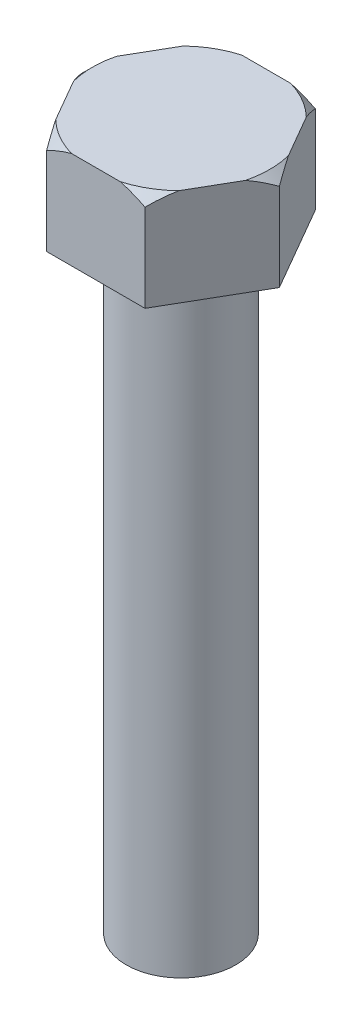
ISO-10303-21;
HEADER;
FILE_DESCRIPTION(('STEP AP214'),'2;1');
FILE_NAME('part.step','',(''),(''),'','','');
FILE_SCHEMA(('AUTOMOTIVE_DESIGN { 1 0 10303 214 1 1 1 1 }'));
ENDSEC;
DATA;
#1=APPLICATION_CONTEXT('core data for automotive mechanical design processes');
#2=APPLICATION_PROTOCOL_DEFINITION('international standard','automotive_design',2000,#1);
#3=PRODUCT_CONTEXT('',#1,'mechanical');
#4=PRODUCT('Part','Part','',(#3));
#5=PRODUCT_RELATED_PRODUCT_CATEGORY('part','',(#4));
#6=PRODUCT_DEFINITION_FORMATION('','',#4);
#7=PRODUCT_DEFINITION_CONTEXT('part definition',#1,'design');
#8=PRODUCT_DEFINITION('design','',#6,#7);
#9=PRODUCT_DEFINITION_SHAPE('','',#8);
#10=(LENGTH_UNIT() NAMED_UNIT(*) SI_UNIT(.MILLI.,.METRE.));
#11=(NAMED_UNIT(*) PLANE_ANGLE_UNIT() SI_UNIT($,.RADIAN.));
#12=(NAMED_UNIT(*) SI_UNIT($,.STERADIAN.) SOLID_ANGLE_UNIT());
#13=UNCERTAINTY_MEASURE_WITH_UNIT(LENGTH_MEASURE(1.E-05),#10,'distance_accuracy_value','');
#14=(GEOMETRIC_REPRESENTATION_CONTEXT(3) GLOBAL_UNCERTAINTY_ASSIGNED_CONTEXT((#13)) GLOBAL_UNIT_ASSIGNED_CONTEXT((#10,
#11,#12)) REPRESENTATION_CONTEXT('',''));
#15=CARTESIAN_POINT('',(0.,0.,0.));
#16=DIRECTION('',(0.,0.,1.));
#17=DIRECTION('',(1.,0.,0.));
#18=AXIS2_PLACEMENT_3D('',#15,#16,#17);
#19=CARTESIAN_POINT('',(0.,29.,0.));
#20=DIRECTION('',(0.,1.,0.));
#21=DIRECTION('',(0.,0.,1.));
#22=AXIS2_PLACEMENT_3D('',#19,#20,#21);
#23=PLANE('',#22);
#24=CARTESIAN_POINT('',(0.,29.,0.));
#25=DIRECTION('',(0.,1.,0.));
#26=DIRECTION('',(0.,0.,1.));
#27=AXIS2_PLACEMENT_3D('',#24,#25,#26);
#28=CIRCLE('',#27,3.64145188432738);
#29=CARTESIAN_POINT('',(-1.00507304504271,29.,3.5));
#30=VERTEX_POINT('',#29);
#31=CARTESIAN_POINT('',(-2.52855239072418,29.,2.62041878966597));
#32=VERTEX_POINT('',#31);
#33=EDGE_CURVE('E11',#30,#32,#28,.F.);
#34=ORIENTED_EDGE('',*,*,#33,.F.);
#35=DIRECTION('',(1.,0.,0.));
#36=VECTOR('',#35,1.);
#37=CARTESIAN_POINT('',(0.,29.,3.5));
#38=LINE('',#37,#36);
#39=CARTESIAN_POINT('',(1.00507304504271,29.,3.5));
#40=VERTEX_POINT('',#39);
#41=EDGE_CURVE('E142',#30,#40,#38,.T.);
#42=ORIENTED_EDGE('',*,*,#41,.T.);
#43=CARTESIAN_POINT('',(2.52855239072418,29.,2.62041878966597));
#44=VERTEX_POINT('',#43);
#45=EDGE_CURVE('E43',#44,#40,#28,.F.);
#46=ORIENTED_EDGE('',*,*,#45,.F.);
#47=DIRECTION('',(0.5,0.,-0.866025403784439));
#48=VECTOR('',#47,1.);
#49=CARTESIAN_POINT('',(3.03108891324554,29.,1.75));
#50=LINE('',#49,#48);
#51=CARTESIAN_POINT('',(3.53362543576689,29.,0.879581210334031));
#52=VERTEX_POINT('',#51);
#53=EDGE_CURVE('E169',#44,#52,#50,.T.);
#54=ORIENTED_EDGE('',*,*,#53,.T.);
#55=CARTESIAN_POINT('',(3.53362543576689,29.,-0.879581210334034));
#56=VERTEX_POINT('',#55);
#57=EDGE_CURVE('E300',#56,#52,#28,.F.);
#58=ORIENTED_EDGE('',*,*,#57,.F.);
#59=DIRECTION('',(-0.5,0.,-0.866025403784439));
#60=VECTOR('',#59,1.);
#61=CARTESIAN_POINT('',(3.03108891324554,29.,-1.75));
#62=LINE('',#61,#60);
#63=CARTESIAN_POINT('',(2.52855239072418,29.,-2.62041878966597));
#64=VERTEX_POINT('',#63);
#65=EDGE_CURVE('E266',#56,#64,#62,.T.);
#66=ORIENTED_EDGE('',*,*,#65,.T.);
#67=CARTESIAN_POINT('',(1.00507304504271,29.,-3.5));
#68=VERTEX_POINT('',#67);
#69=EDGE_CURVE('E274',#68,#64,#28,.F.);
#70=ORIENTED_EDGE('',*,*,#69,.F.);
#71=DIRECTION('',(-1.,0.,0.));
#72=VECTOR('',#71,1.);
#73=CARTESIAN_POINT('',(0.,29.,-3.5));
#74=LINE('',#73,#72);
#75=CARTESIAN_POINT('',(-1.00507304504271,29.,-3.5));
#76=VERTEX_POINT('',#75);
#77=EDGE_CURVE('E147',#68,#76,#74,.T.);
#78=ORIENTED_EDGE('',*,*,#77,.T.);
#79=CARTESIAN_POINT('',(-2.52855239072418,29.,-2.62041878966597));
#80=VERTEX_POINT('',#79);
#81=EDGE_CURVE('E272',#80,#76,#28,.F.);
#82=ORIENTED_EDGE('',*,*,#81,.F.);
#83=DIRECTION('',(-0.5,0.,0.866025403784439));
#84=VECTOR('',#83,1.);
#85=CARTESIAN_POINT('',(-3.03108891324553,29.,-1.75));
#86=LINE('',#85,#84);
#87=CARTESIAN_POINT('',(-3.53362543576689,29.,-0.879581210334033));
#88=VERTEX_POINT('',#87);
#89=EDGE_CURVE('E143',#80,#88,#86,.T.);
#90=ORIENTED_EDGE('',*,*,#89,.T.);
#91=CARTESIAN_POINT('',(-3.53362543576689,29.,0.879581210334033));
#92=VERTEX_POINT('',#91);
#93=EDGE_CURVE('E48',#92,#88,#28,.F.);
#94=ORIENTED_EDGE('',*,*,#93,.F.);
#95=DIRECTION('',(0.5,0.,0.866025403784439));
#96=VECTOR('',#95,1.);
#97=CARTESIAN_POINT('',(-3.03108891324553,29.,1.75));
#98=LINE('',#97,#96);
#99=EDGE_CURVE('E136',#92,#32,#98,.T.);
#100=ORIENTED_EDGE('',*,*,#99,.T.);
#101=EDGE_LOOP('',(#34,#42,#46,#54,#58,#66,#70,#78,#82,#90,#94,#100));
#102=FACE_BOUND('',#101,.T.);
#103=ADVANCED_FACE('F39',(#102),#23,.T.);
#104=CARTESIAN_POINT('',(0.,25.,0.));
#105=DIRECTION('',(0.,-1.,0.));
#106=DIRECTION('',(0.,0.,-1.));
#107=AXIS2_PLACEMENT_3D('',#104,#105,#106);
#108=CYLINDRICAL_SURFACE('',#107,2.25);
#109=CARTESIAN_POINT('',(0.,25.,0.));
#110=DIRECTION('',(0.,1.,0.));
#111=DIRECTION('',(0.,0.,1.));
#112=AXIS2_PLACEMENT_3D('',#109,#110,#111);
#113=CIRCLE('',#112,2.25);
#114=CARTESIAN_POINT('',(0.,25.,2.25));
#115=VERTEX_POINT('',#114);
#116=EDGE_CURVE('E181',#115,#115,#113,.T.);
#117=ORIENTED_EDGE('',*,*,#116,.F.);
#118=EDGE_LOOP('',(#117));
#119=FACE_BOUND('',#118,.T.);
#120=CARTESIAN_POINT('',(0.,0.,0.));
#121=DIRECTION('',(0.,1.,0.));
#122=DIRECTION('',(0.,0.,1.));
#123=AXIS2_PLACEMENT_3D('',#120,#121,#122);
#124=CIRCLE('',#123,2.25);
#125=CARTESIAN_POINT('',(0.,0.,2.25));
#126=VERTEX_POINT('',#125);
#127=EDGE_CURVE('E180',#126,#126,#124,.T.);
#128=ORIENTED_EDGE('',*,*,#127,.T.);
#129=EDGE_LOOP('',(#128));
#130=FACE_BOUND('',#129,.T.);
#131=ADVANCED_FACE('F41',(#119,#130),#108,.T.);
#132=CARTESIAN_POINT('',(0.,0.,0.));
#133=DIRECTION('',(0.,1.,0.));
#134=DIRECTION('',(0.,0.,1.));
#135=AXIS2_PLACEMENT_3D('',#132,#133,#134);
#136=PLANE('',#135);
#137=ORIENTED_EDGE('',*,*,#127,.F.);
#138=EDGE_LOOP('',(#137));
#139=FACE_BOUND('',#138,.T.);
#140=ADVANCED_FACE('F187',(#139),#136,.F.);
#141=CARTESIAN_POINT('',(3.03108891324554,29.,1.75));
#142=DIRECTION('',(-0.866025403784439,0.,-0.5));
#143=DIRECTION('',(-0.5,0.,0.866025403784439));
#144=AXIS2_PLACEMENT_3D('',#141,#142,#143);
#145=PLANE('',#144);
#146=DIRECTION('',(0.,-1.,0.));
#147=VECTOR('',#146,1.);
#148=CARTESIAN_POINT('',(4.04145188432738,29.,0.));
#149=LINE('',#148,#147);
#150=CARTESIAN_POINT('',(4.04145188432738,28.6,0.));
#151=VERTEX_POINT('',#150);
#152=CARTESIAN_POINT('',(4.04145188432738,25.,0.));
#153=VERTEX_POINT('',#152);
#154=EDGE_CURVE('E178',#151,#153,#149,.T.);
#155=ORIENTED_EDGE('',*,*,#154,.F.);
#156=CARTESIAN_POINT('',(4.04185602951581,28.5995957941958,-0.000700000000000803));
#157=CARTESIAN_POINT('',(4.00710000804431,28.6343560383964,0.0594991950575953));
#158=CARTESIAN_POINT('',(3.97207797795043,28.6680501603169,0.120159130564405));
#159=CARTESIAN_POINT('',(3.90144705858413,28.7329810613726,0.242495471492139));
#160=CARTESIAN_POINT('',(3.86583786127703,28.7642164976156,0.304172410444787));
#161=CARTESIAN_POINT('',(3.75771605567358,28.8540137903599,0.491444871156037));
#162=CARTESIAN_POINT('',(3.68428424700295,28.9082831640575,0.618632494665241));
#163=CARTESIAN_POINT('',(3.53623163816097,29.0012236799121,0.875067135372671));
#164=CARTESIAN_POINT('',(3.46164827767626,29.0401289976709,1.00424930513143));
#165=CARTESIAN_POINT('',(3.31083374854042,29.1000772712033,1.26546773211428));
#166=CARTESIAN_POINT('',(3.23460720553374,29.1211649889939,1.39749597748718));
#167=CARTESIAN_POINT('',(3.10324884559524,29.1401900959649,1.62501533089957));
#168=CARTESIAN_POINT('',(3.04828650790208,29.1430074756386,1.7202128922869));
#169=CARTESIAN_POINT('',(2.93845087445834,29.1382704066968,1.91045378989296));
#170=CARTESIAN_POINT('',(2.88357761668902,29.1307123207898,2.00549706032624));
#171=CARTESIAN_POINT('',(2.77435085644443,29.105655411488,2.19468335861602));
#172=CARTESIAN_POINT('',(2.71999800529152,29.0881454583365,2.28882525834909));
#173=CARTESIAN_POINT('',(2.61222572095588,29.0441407177875,2.47549233046617));
#174=CARTESIAN_POINT('',(2.55880621658997,29.0176466187531,2.56801762614308));
#175=CARTESIAN_POINT('',(2.46394385258427,28.9631195495437,2.73232406032705));
#176=CARTESIAN_POINT('',(2.42229155147872,28.9365164818021,2.80446796209402));
#177=CARTESIAN_POINT('',(2.33973521538547,28.8790202066085,2.94745973069426));
#178=CARTESIAN_POINT('',(2.29883120381619,28.8481268651474,3.01830755696563));
#179=CARTESIAN_POINT('',(2.21790026519835,28.7827433327658,3.15848405455598));
#180=CARTESIAN_POINT('',(2.17787103570062,28.7482644470191,3.22781671383387));
#181=CARTESIAN_POINT('',(2.09855442737231,28.6761632616106,3.36519710934255));
#182=CARTESIAN_POINT('',(2.05926660994313,28.6385428966948,3.43324560524837));
#183=CARTESIAN_POINT('',(2.02032179697526,28.5995957941959,3.5007));
#184=B_SPLINE_CURVE_WITH_KNOTS('',3,(#156,#157,#158,#159,#160,#161,#162,#163,#164,#165,#166,
#167,#168,#169,#170,#171,#172,#173,#174,#175,#176,#177,#178,#179,#180,#181,#182,#183),
.UNSPECIFIED.,.F.,.F.,(4,2,2,2,2,2,2,2,2,2,2,2,2,4),(0.,0.233138513867682,0.466403492968363,
0.93545442848912,1.39705139101095,1.85748523555109,2.18690223171021,2.51643473995426,
2.84633651094476,3.17621301064566,3.43843771846077,3.70067061885163,3.96210042566853,
4.22337039640857),.UNSPECIFIED.);
#185=EDGE_CURVE('E155',#151,#52,#184,.T.);
#186=ORIENTED_EDGE('',*,*,#185,.T.);
#187=ORIENTED_EDGE('',*,*,#53,.F.);
#188=CARTESIAN_POINT('',(2.02072594216369,28.6,3.5));
#189=VERTEX_POINT('',#188);
#190=EDGE_CURVE('E228',#44,#189,#184,.T.);
#191=ORIENTED_EDGE('',*,*,#190,.T.);
#192=DIRECTION('',(0.,-1.,0.));
#193=VECTOR('',#192,1.);
#194=CARTESIAN_POINT('',(2.02072594216369,29.,3.5));
#195=LINE('',#194,#193);
#196=CARTESIAN_POINT('',(2.02072594216369,25.,3.5));
#197=VERTEX_POINT('',#196);
#198=EDGE_CURVE('E145',#189,#197,#195,.T.);
#199=ORIENTED_EDGE('',*,*,#198,.T.);
#200=DIRECTION('',(0.5,0.,-0.866025403784439));
#201=VECTOR('',#200,1.);
#202=CARTESIAN_POINT('',(3.03108891324554,25.,1.75));
#203=LINE('',#202,#201);
#204=EDGE_CURVE('E151',#197,#153,#203,.T.);
#205=ORIENTED_EDGE('',*,*,#204,.T.);
#206=EDGE_LOOP('',(#155,#186,#187,#191,#199,#205));
#207=FACE_BOUND('',#206,.T.);
#208=ADVANCED_FACE('F189',(#207),#145,.F.);
#209=CARTESIAN_POINT('',(3.03108891324554,29.,-1.75));
#210=DIRECTION('',(-0.866025403784438,0.,0.5));
#211=DIRECTION('',(0.5,0.,0.866025403784439));
#212=AXIS2_PLACEMENT_3D('',#209,#210,#211);
#213=PLANE('',#212);
#214=DIRECTION('',(0.,-1.,0.));
#215=VECTOR('',#214,1.);
#216=CARTESIAN_POINT('',(2.02072594216369,29.,-3.5));
#217=LINE('',#216,#215);
#218=CARTESIAN_POINT('',(2.02072594216369,28.6,-3.5));
#219=VERTEX_POINT('',#218);
#220=CARTESIAN_POINT('',(2.02072594216369,25.,-3.5));
#221=VERTEX_POINT('',#220);
#222=EDGE_CURVE('E176',#219,#221,#217,.T.);
#223=ORIENTED_EDGE('',*,*,#222,.F.);
#224=CARTESIAN_POINT('',(2.02032179697526,28.5995957941959,-3.5007));
#225=CARTESIAN_POINT('',(2.05507781844676,28.6343560383964,-3.4405008049424));
#226=CARTESIAN_POINT('',(2.09009984854064,28.6680501603169,-3.37984086943559));
#227=CARTESIAN_POINT('',(2.16073076790694,28.7329810613726,-3.25750452850786));
#228=CARTESIAN_POINT('',(2.19633996521405,28.7642164976156,-3.19582758955521));
#229=CARTESIAN_POINT('',(2.30446177081749,28.8540137903599,-3.00855512884396));
#230=CARTESIAN_POINT('',(2.37789357948812,28.9082831640575,-2.88136750533476));
#231=CARTESIAN_POINT('',(2.5259461883301,29.0012236799121,-2.62493286462733));
#232=CARTESIAN_POINT('',(2.60052954881481,29.0401289976709,-2.49575069486857));
#233=CARTESIAN_POINT('',(2.75134407795065,29.1000772712033,-2.23453226788572));
#234=CARTESIAN_POINT('',(2.82757062095733,29.1211649889939,-2.10250402251282));
#235=CARTESIAN_POINT('',(2.95892898089583,29.1401900959649,-1.87498466910043));
#236=CARTESIAN_POINT('',(3.01389131858899,29.1430074756386,-1.77978710771311));
#237=CARTESIAN_POINT('',(3.12372695203273,29.1382704066968,-1.58954621010704));
#238=CARTESIAN_POINT('',(3.17860020980205,29.1307123207898,-1.49450293967376));
#239=CARTESIAN_POINT('',(3.28782697004664,29.105655411488,-1.30531664138398));
#240=CARTESIAN_POINT('',(3.34217982119955,29.0881454583365,-1.21117474165092));
#241=CARTESIAN_POINT('',(3.44995210553519,29.0441407177875,-1.02450766953383));
#242=CARTESIAN_POINT('',(3.5033716099011,29.0176466187531,-0.931982373856925));
#243=CARTESIAN_POINT('',(3.5982339739068,28.9631195495437,-0.767675939672956));
#244=CARTESIAN_POINT('',(3.63988627501235,28.9365164818021,-0.695532037905984));
#245=CARTESIAN_POINT('',(3.7224426111056,28.8790202066085,-0.552540269305745));
#246=CARTESIAN_POINT('',(3.76334662267488,28.8481268651474,-0.48169244303437));
#247=CARTESIAN_POINT('',(3.84427756129273,28.7827433327658,-0.341515945444022));
#248=CARTESIAN_POINT('',(3.88430679079045,28.7482644470191,-0.272183286166127));
#249=CARTESIAN_POINT('',(3.96362339911876,28.6761632616106,-0.13480289065745));
#250=CARTESIAN_POINT('',(4.00291121654794,28.6385428966948,-0.0667543947516297));
#251=CARTESIAN_POINT('',(4.04185602951581,28.5995957941958,0.000700000000000456));
#252=B_SPLINE_CURVE_WITH_KNOTS('',3,(#224,#225,#226,#227,#228,#229,#230,#231,#232,#233,#234,
#235,#236,#237,#238,#239,#240,#241,#242,#243,#244,#245,#246,#247,#248,#249,#250,#251),
.UNSPECIFIED.,.F.,.F.,(4,2,2,2,2,2,2,2,2,2,2,2,2,4),(0.,0.233138513867682,0.466403492968361,
0.935454428489117,1.39705139101095,1.85748523555109,2.18690223171021,2.51643473995426,
2.84633651094476,3.17621301064565,3.43843771846077,3.70067061885162,3.96210042566853,
4.22337039640857),.UNSPECIFIED.);
#253=EDGE_CURVE('E250',#219,#64,#252,.T.);
#254=ORIENTED_EDGE('',*,*,#253,.T.);
#255=ORIENTED_EDGE('',*,*,#65,.F.);
#256=EDGE_CURVE('E257',#56,#151,#252,.T.);
#257=ORIENTED_EDGE('',*,*,#256,.T.);
#258=ORIENTED_EDGE('',*,*,#154,.T.);
#259=DIRECTION('',(-0.5,0.,-0.866025403784439));
#260=VECTOR('',#259,1.);
#261=CARTESIAN_POINT('',(3.03108891324554,25.,-1.75));
#262=LINE('',#261,#260);
#263=EDGE_CURVE('E154',#153,#221,#262,.T.);
#264=ORIENTED_EDGE('',*,*,#263,.T.);
#265=EDGE_LOOP('',(#223,#254,#255,#257,#258,#264));
#266=FACE_BOUND('',#265,.T.);
#267=ADVANCED_FACE('F194',(#266),#213,.F.);
#268=CARTESIAN_POINT('',(0.,29.,-3.5));
#269=DIRECTION('',(0.,0.,1.));
#270=DIRECTION('',(1.,0.,0.));
#271=AXIS2_PLACEMENT_3D('',#268,#269,#270);
#272=PLANE('',#271);
#273=DIRECTION('',(0.,-1.,0.));
#274=VECTOR('',#273,1.);
#275=CARTESIAN_POINT('',(-2.02072594216369,29.,-3.5));
#276=LINE('',#275,#274);
#277=CARTESIAN_POINT('',(-2.02072594216369,28.6,-3.5));
#278=VERTEX_POINT('',#277);
#279=CARTESIAN_POINT('',(-2.02072594216369,25.,-3.5));
#280=VERTEX_POINT('',#279);
#281=EDGE_CURVE('E174',#278,#280,#276,.T.);
#282=ORIENTED_EDGE('',*,*,#281,.F.);
#283=CARTESIAN_POINT('',(-2.02142594216369,28.5996499545376,-3.5));
#284=CARTESIAN_POINT('',(-1.95191716585992,28.6344071698307,-3.5));
#285=CARTESIAN_POINT('',(-1.88187641293746,28.6680983012879,-3.5));
#286=CARTESIAN_POINT('',(-1.74062129495427,28.733023332027,-3.5));
#287=CARTESIAN_POINT('',(-1.6694063139369,28.7642558886051,-3.5));
#288=CARTESIAN_POINT('',(-1.45317328965161,28.8540446860065,-3.5));
#289=CARTESIAN_POINT('',(-1.3063170334576,28.9083086843725,-3.5));
#290=CARTESIAN_POINT('',(-1.01022672709192,29.0012397440846,-3.5));
#291=CARTESIAN_POINT('',(-0.861067537276391,29.0401409339471,-3.5));
#292=CARTESIAN_POINT('',(-0.559454026819059,29.1000826050514,-3.5));
#293=CARTESIAN_POINT('',(-0.407008954560344,29.1211678370351,-3.5));
#294=CARTESIAN_POINT('',(-0.144300658171568,29.1401908783688,-3.5));
#295=CARTESIAN_POINT('',(-0.0343762965584201,29.1430076496579,-3.5));
#296=CARTESIAN_POINT('',(0.185294284221491,29.1382694331094,-3.5));
#297=CARTESIAN_POINT('',(0.295040427411432,29.1307108082559,-3.5));
#298=CARTESIAN_POINT('',(0.513493142386336,29.1056529238488,-3.5));
#299=CARTESIAN_POINT('',(0.62219841172822,29.0881425367336,-3.5));
#300=CARTESIAN_POINT('',(0.837742099657707,29.0441370425552,-3.5));
#301=CARTESIAN_POINT('',(0.944580660632066,29.0176426239399,-3.5));
#302=CARTESIAN_POINT('',(1.1342939169254,28.9631181458802,-3.5));
#303=CARTESIAN_POINT('',(1.21758767834357,28.9365185914998,-3.5));
#304=CARTESIAN_POINT('',(1.38267905366094,28.8790304194587,-3.5));
#305=CARTESIAN_POINT('',(1.46447662095422,28.8481416684478,-3.5));
#306=CARTESIAN_POINT('',(1.62631798502969,28.782768158183,-3.5));
#307=CARTESIAN_POINT('',(1.70636638590272,28.7482947024355,-3.5));
#308=CARTESIAN_POINT('',(1.8649798713113,28.6762050258862,-3.5));
#309=CARTESIAN_POINT('',(1.94354583232979,28.6385907383224,-3.5));
#310=CARTESIAN_POINT('',(2.02142594216369,28.5996499545376,-3.5));
#311=B_SPLINE_CURVE_WITH_KNOTS('',3,(#283,#284,#285,#286,#287,#288,#289,#290,#291,#292,#293,
#294,#295,#296,#297,#298,#299,#300,#301,#302,#303,#304,#305,#306,#307,#308,#309,#310),
.UNSPECIFIED.,.F.,.F.,(4,2,2,2,2,2,2,2,2,2,2,2,2,4),(0.,0.233125685720429,0.466377817799902,
0.935402505702332,1.39697458003974,1.85738378555074,2.18679979381389,2.5163313058325,
2.8462320104388,3.1761074404035,3.43829801434273,3.70049674156425,3.96189241394212,
4.22312836216602),.UNSPECIFIED.);
#312=EDGE_CURVE('E259',#278,#76,#311,.T.);
#313=ORIENTED_EDGE('',*,*,#312,.T.);
#314=ORIENTED_EDGE('',*,*,#77,.F.);
#315=EDGE_CURVE('E258',#68,#219,#311,.T.);
#316=ORIENTED_EDGE('',*,*,#315,.T.);
#317=ORIENTED_EDGE('',*,*,#222,.T.);
#318=DIRECTION('',(-1.,0.,0.));
#319=VECTOR('',#318,1.);
#320=CARTESIAN_POINT('',(0.,25.,-3.5));
#321=LINE('',#320,#319);
#322=EDGE_CURVE('E158',#221,#280,#321,.T.);
#323=ORIENTED_EDGE('',*,*,#322,.T.);
#324=EDGE_LOOP('',(#282,#313,#314,#316,#317,#323));
#325=FACE_BOUND('',#324,.T.);
#326=ADVANCED_FACE('F246',(#325),#272,.F.);
#327=CARTESIAN_POINT('',(-3.03108891324553,29.,-1.75));
#328=DIRECTION('',(0.866025403784439,0.,0.5));
#329=DIRECTION('',(0.5,0.,-0.866025403784439));
#330=AXIS2_PLACEMENT_3D('',#327,#328,#329);
#331=PLANE('',#330);
#332=DIRECTION('',(0.,-1.,0.));
#333=VECTOR('',#332,1.);
#334=CARTESIAN_POINT('',(-4.04145188432738,29.,0.));
#335=LINE('',#334,#333);
#336=CARTESIAN_POINT('',(-4.04145188432738,28.6,0.));
#337=VERTEX_POINT('',#336);
#338=CARTESIAN_POINT('',(-4.04145188432738,25.,0.));
#339=VERTEX_POINT('',#338);
#340=EDGE_CURVE('E172',#337,#339,#335,.T.);
#341=ORIENTED_EDGE('',*,*,#340,.F.);
#342=CARTESIAN_POINT('',(-4.04185602951581,28.5995957941959,0.000699999999999991));
#343=CARTESIAN_POINT('',(-4.00710000804431,28.6343560383964,-0.0594991950575977));
#344=CARTESIAN_POINT('',(-3.97207797795043,28.6680501603169,-0.120159130564408));
#345=CARTESIAN_POINT('',(-3.90144705858413,28.7329810613726,-0.242495471492142));
#346=CARTESIAN_POINT('',(-3.86583786127702,28.7642164976156,-0.30417241044479));
#347=CARTESIAN_POINT('',(-3.75771605567358,28.8540137903599,-0.49144487115604));
#348=CARTESIAN_POINT('',(-3.68428424700295,28.9082831640575,-0.618632494665245));
#349=CARTESIAN_POINT('',(-3.53623163816097,29.0012236799121,-0.875067135372674));
#350=CARTESIAN_POINT('',(-3.46164827767625,29.0401289976709,-1.00424930513143));
#351=CARTESIAN_POINT('',(-3.31083374854041,29.1000772712033,-1.26546773211428));
#352=CARTESIAN_POINT('',(-3.23460720553373,29.1211649889939,-1.39749597748719));
#353=CARTESIAN_POINT('',(-3.10324884559524,29.1401900959649,-1.62501533089958));
#354=CARTESIAN_POINT('',(-3.04828650790207,29.1430074756386,-1.7202128922869));
#355=CARTESIAN_POINT('',(-2.93845087445834,29.1382704066968,-1.91045378989297));
#356=CARTESIAN_POINT('',(-2.88357761668902,29.1307123207898,-2.00549706032625));
#357=CARTESIAN_POINT('',(-2.77435085644443,29.105655411488,-2.19468335861602));
#358=CARTESIAN_POINT('',(-2.71999800529152,29.0881454583365,-2.28882525834909));
#359=CARTESIAN_POINT('',(-2.61222572095588,29.0441407177875,-2.47549233046618));
#360=CARTESIAN_POINT('',(-2.55880621658997,29.0176466187531,-2.56801762614308));
#361=CARTESIAN_POINT('',(-2.46394385258427,28.9631195495437,-2.73232406032705));
#362=CARTESIAN_POINT('',(-2.42229155147871,28.9365164818021,-2.80446796209402));
#363=CARTESIAN_POINT('',(-2.33973521538547,28.8790202066085,-2.94745973069426));
#364=CARTESIAN_POINT('',(-2.29883120381619,28.8481268651474,-3.01830755696563));
#365=CARTESIAN_POINT('',(-2.21790026519834,28.7827433327658,-3.15848405455598));
#366=CARTESIAN_POINT('',(-2.17787103570062,28.7482644470191,-3.22781671383388));
#367=CARTESIAN_POINT('',(-2.09855442737231,28.6761632616106,-3.36519710934255));
#368=CARTESIAN_POINT('',(-2.05926660994313,28.6385428966948,-3.43324560524837));
#369=CARTESIAN_POINT('',(-2.02032179697526,28.5995957941959,-3.5007));
#370=B_SPLINE_CURVE_WITH_KNOTS('',3,(#342,#343,#344,#345,#346,#347,#348,#349,#350,#351,#352,
#353,#354,#355,#356,#357,#358,#359,#360,#361,#362,#363,#364,#365,#366,#367,#368,#369),
.UNSPECIFIED.,.F.,.F.,(4,2,2,2,2,2,2,2,2,2,2,2,2,4),(0.,0.233138513867683,0.466403492968365,
0.935454428489124,1.39705139101096,1.85748523555109,2.18690223171022,2.51643473995427,
2.84633651094476,3.17621301064566,3.43843771846077,3.70067061885163,3.96210042566853,
4.22337039640856),.UNSPECIFIED.);
#371=EDGE_CURVE('E235',#337,#88,#370,.T.);
#372=ORIENTED_EDGE('',*,*,#371,.T.);
#373=ORIENTED_EDGE('',*,*,#89,.F.);
#374=EDGE_CURVE('E282',#80,#278,#370,.T.);
#375=ORIENTED_EDGE('',*,*,#374,.T.);
#376=ORIENTED_EDGE('',*,*,#281,.T.);
#377=DIRECTION('',(-0.5,0.,0.866025403784439));
#378=VECTOR('',#377,1.);
#379=CARTESIAN_POINT('',(-3.03108891324553,25.,-1.75));
#380=LINE('',#379,#378);
#381=EDGE_CURVE('E161',#280,#339,#380,.T.);
#382=ORIENTED_EDGE('',*,*,#381,.T.);
#383=EDGE_LOOP('',(#341,#372,#373,#375,#376,#382));
#384=FACE_BOUND('',#383,.T.);
#385=ADVANCED_FACE('F286',(#384),#331,.F.);
#386=CARTESIAN_POINT('',(-3.03108891324553,29.,1.75));
#387=DIRECTION('',(0.866025403784439,0.,-0.5));
#388=DIRECTION('',(-0.5,0.,-0.866025403784439));
#389=AXIS2_PLACEMENT_3D('',#386,#387,#388);
#390=PLANE('',#389);
#391=DIRECTION('',(0.,-1.,0.));
#392=VECTOR('',#391,1.);
#393=CARTESIAN_POINT('',(-2.02072594216369,29.,3.5));
#394=LINE('',#393,#392);
#395=CARTESIAN_POINT('',(-2.02072594216369,28.6,3.5));
#396=VERTEX_POINT('',#395);
#397=CARTESIAN_POINT('',(-2.02072594216369,25.,3.5));
#398=VERTEX_POINT('',#397);
#399=EDGE_CURVE('E138',#396,#398,#394,.T.);
#400=ORIENTED_EDGE('',*,*,#399,.F.);
#401=CARTESIAN_POINT('',(-2.02032179697526,28.5995957941959,3.5007));
#402=CARTESIAN_POINT('',(-2.05507781844676,28.6343560383964,3.4405008049424));
#403=CARTESIAN_POINT('',(-2.09009984854064,28.6680501603169,3.37984086943559));
#404=CARTESIAN_POINT('',(-2.16073076790694,28.7329810613726,3.25750452850786));
#405=CARTESIAN_POINT('',(-2.19633996521405,28.7642164976156,3.19582758955521));
#406=CARTESIAN_POINT('',(-2.30446177081749,28.8540137903599,3.00855512884396));
#407=CARTESIAN_POINT('',(-2.37789357948812,28.9082831640575,2.88136750533475));
#408=CARTESIAN_POINT('',(-2.5259461883301,29.0012236799121,2.62493286462733));
#409=CARTESIAN_POINT('',(-2.60052954881482,29.0401289976709,2.49575069486857));
#410=CARTESIAN_POINT('',(-2.75134407795066,29.1000772712033,2.23453226788572));
#411=CARTESIAN_POINT('',(-2.82757062095734,29.1211649889939,2.10250402251281));
#412=CARTESIAN_POINT('',(-2.95892898089583,29.1401900959649,1.87498466910042));
#413=CARTESIAN_POINT('',(-3.013891318589,29.1430074756386,1.7797871077131));
#414=CARTESIAN_POINT('',(-3.12372695203273,29.1382704066968,1.58954621010703));
#415=CARTESIAN_POINT('',(-3.17860020980205,29.1307123207898,1.49450293967375));
#416=CARTESIAN_POINT('',(-3.28782697004664,29.105655411488,1.30531664138398));
#417=CARTESIAN_POINT('',(-3.34217982119955,29.0881454583365,1.21117474165091));
#418=CARTESIAN_POINT('',(-3.44995210553519,29.0441407177875,1.02450766953382));
#419=CARTESIAN_POINT('',(-3.5033716099011,29.0176466187531,0.931982373856919));
#420=CARTESIAN_POINT('',(-3.5982339739068,28.9631195495437,0.76767593967295));
#421=CARTESIAN_POINT('',(-3.63988627501235,28.9365164818021,0.695532037905978));
#422=CARTESIAN_POINT('',(-3.7224426111056,28.8790202066085,0.552540269305741));
#423=CARTESIAN_POINT('',(-3.76334662267488,28.8481268651474,0.481692443034366));
#424=CARTESIAN_POINT('',(-3.84427756129273,28.7827433327658,0.341515945444019));
#425=CARTESIAN_POINT('',(-3.88430679079045,28.7482644470191,0.272183286166124));
#426=CARTESIAN_POINT('',(-3.96362339911876,28.6761632616106,0.134802890657449));
#427=CARTESIAN_POINT('',(-4.00291121654794,28.6385428966948,0.0667543947516295));
#428=CARTESIAN_POINT('',(-4.04185602951581,28.5995957941959,-0.000700000000000128));
#429=B_SPLINE_CURVE_WITH_KNOTS('',3,(#401,#402,#403,#404,#405,#406,#407,#408,#409,#410,#411,
#412,#413,#414,#415,#416,#417,#418,#419,#420,#421,#422,#423,#424,#425,#426,#427,#428),
.UNSPECIFIED.,.F.,.F.,(4,2,2,2,2,2,2,2,2,2,2,2,2,4),(0.,0.233138513867683,0.466403492968365,
0.935454428489123,1.39705139101096,1.85748523555109,2.18690223171022,2.51643473995426,
2.84633651094476,3.17621301064566,3.43843771846077,3.70067061885163,3.96210042566853,
4.22337039640856),.UNSPECIFIED.);
#430=EDGE_CURVE('E127',#396,#32,#429,.T.);
#431=ORIENTED_EDGE('',*,*,#430,.T.);
#432=ORIENTED_EDGE('',*,*,#99,.F.);
#433=EDGE_CURVE('E62',#92,#337,#429,.T.);
#434=ORIENTED_EDGE('',*,*,#433,.T.);
#435=ORIENTED_EDGE('',*,*,#340,.T.);
#436=DIRECTION('',(0.5,0.,0.866025403784439));
#437=VECTOR('',#436,1.);
#438=CARTESIAN_POINT('',(-3.03108891324553,25.,1.75));
#439=LINE('',#438,#437);
#440=EDGE_CURVE('E164',#339,#398,#439,.T.);
#441=ORIENTED_EDGE('',*,*,#440,.T.);
#442=EDGE_LOOP('',(#400,#431,#432,#434,#435,#441));
#443=FACE_BOUND('',#442,.T.);
#444=ADVANCED_FACE('F135',(#443),#390,.F.);
#445=CARTESIAN_POINT('',(0.,29.,3.5));
#446=DIRECTION('',(0.,0.,-1.));
#447=DIRECTION('',(-1.,0.,0.));
#448=AXIS2_PLACEMENT_3D('',#445,#446,#447);
#449=PLANE('',#448);
#450=ORIENTED_EDGE('',*,*,#198,.F.);
#451=CARTESIAN_POINT('',(2.02142594216369,28.5996499545376,3.5));
#452=CARTESIAN_POINT('',(1.95191716585992,28.6344071698307,3.5));
#453=CARTESIAN_POINT('',(1.88187641293746,28.6680983012879,3.5));
#454=CARTESIAN_POINT('',(1.74062129495427,28.733023332027,3.5));
#455=CARTESIAN_POINT('',(1.66940631393691,28.7642558886051,3.5));
#456=CARTESIAN_POINT('',(1.45317328965161,28.8540446860065,3.5));
#457=CARTESIAN_POINT('',(1.3063170334576,28.9083086843725,3.5));
#458=CARTESIAN_POINT('',(1.01022672709192,29.0012397440846,3.5));
#459=CARTESIAN_POINT('',(0.861067537276391,29.0401409339471,3.5));
#460=CARTESIAN_POINT('',(0.559454026819058,29.1000826050514,3.5));
#461=CARTESIAN_POINT('',(0.407008954560343,29.1211678370351,3.5));
#462=CARTESIAN_POINT('',(0.144300658171566,29.1401908783688,3.5));
#463=CARTESIAN_POINT('',(0.0343762965584185,29.1430076496579,3.5));
#464=CARTESIAN_POINT('',(-0.185294284221492,29.1382694331094,3.5));
#465=CARTESIAN_POINT('',(-0.295040427411433,29.1307108082559,3.5));
#466=CARTESIAN_POINT('',(-0.513493142386338,29.1056529238488,3.5));
#467=CARTESIAN_POINT('',(-0.622198411728221,29.0881425367336,3.5));
#468=CARTESIAN_POINT('',(-0.837742099657708,29.0441370425552,3.5));
#469=CARTESIAN_POINT('',(-0.944580660632067,29.0176426239399,3.5));
#470=CARTESIAN_POINT('',(-1.1342939169254,28.9631181458802,3.5));
#471=CARTESIAN_POINT('',(-1.21758767834357,28.9365185914998,3.5));
#472=CARTESIAN_POINT('',(-1.38267905366094,28.8790304194587,3.5));
#473=CARTESIAN_POINT('',(-1.46447662095422,28.8481416684478,3.5));
#474=CARTESIAN_POINT('',(-1.62631798502969,28.782768158183,3.5));
#475=CARTESIAN_POINT('',(-1.70636638590272,28.7482947024355,3.5));
#476=CARTESIAN_POINT('',(-1.8649798713113,28.6762050258862,3.5));
#477=CARTESIAN_POINT('',(-1.94354583232979,28.6385907383224,3.5));
#478=CARTESIAN_POINT('',(-2.02142594216369,28.5996499545376,3.5));
#479=B_SPLINE_CURVE_WITH_KNOTS('',3,(#451,#452,#453,#454,#455,#456,#457,#458,#459,#460,#461,
#462,#463,#464,#465,#466,#467,#468,#469,#470,#471,#472,#473,#474,#475,#476,#477,#478),
.UNSPECIFIED.,.F.,.F.,(4,2,2,2,2,2,2,2,2,2,2,2,2,4),(0.,0.233125685720428,0.466377817799901,
0.935402505702331,1.39697458003974,1.85738378555074,2.18679979381389,2.51633130583251,
2.8462320104388,3.1761074404035,3.43829801434273,3.70049674156425,3.96189241394211,
4.22312836216602),.UNSPECIFIED.);
#480=EDGE_CURVE('E139',#189,#40,#479,.T.);
#481=ORIENTED_EDGE('',*,*,#480,.T.);
#482=ORIENTED_EDGE('',*,*,#41,.F.);
#483=EDGE_CURVE('E54',#30,#396,#479,.T.);
#484=ORIENTED_EDGE('',*,*,#483,.T.);
#485=ORIENTED_EDGE('',*,*,#399,.T.);
#486=DIRECTION('',(1.,0.,0.));
#487=VECTOR('',#486,1.);
#488=CARTESIAN_POINT('',(0.,25.,3.5));
#489=LINE('',#488,#487);
#490=EDGE_CURVE('E166',#398,#197,#489,.T.);
#491=ORIENTED_EDGE('',*,*,#490,.T.);
#492=EDGE_LOOP('',(#450,#481,#482,#484,#485,#491));
#493=FACE_BOUND('',#492,.T.);
#494=ADVANCED_FACE('F210',(#493),#449,.F.);
#495=CARTESIAN_POINT('',(0.,25.,0.));
#496=DIRECTION('',(0.,1.,0.));
#497=DIRECTION('',(0.,0.,1.));
#498=AXIS2_PLACEMENT_3D('',#495,#496,#497);
#499=PLANE('',#498);
#500=ORIENTED_EDGE('',*,*,#116,.T.);
#501=EDGE_LOOP('',(#500));
#502=FACE_BOUND('',#501,.T.);
#503=ORIENTED_EDGE('',*,*,#204,.F.);
#504=ORIENTED_EDGE('',*,*,#490,.F.);
#505=ORIENTED_EDGE('',*,*,#440,.F.);
#506=ORIENTED_EDGE('',*,*,#381,.F.);
#507=ORIENTED_EDGE('',*,*,#322,.F.);
#508=ORIENTED_EDGE('',*,*,#263,.F.);
#509=EDGE_LOOP('',(#503,#504,#505,#506,#507,#508));
#510=FACE_BOUND('',#509,.T.);
#511=ADVANCED_FACE('F206',(#502,#510),#499,.F.);
#512=CARTESIAN_POINT('',(0.,28.6,0.));
#513=DIRECTION('',(0.,-1.,0.));
#514=DIRECTION('',(1.,0.,0.));
#515=AXIS2_PLACEMENT_3D('',#512,#513,#514);
#516=CONICAL_SURFACE('',#515,4.04145188432738,0.785398163397448);
#517=ORIENTED_EDGE('',*,*,#45,.T.);
#518=ORIENTED_EDGE('',*,*,#480,.F.);
#519=ORIENTED_EDGE('',*,*,#190,.F.);
#520=EDGE_LOOP('',(#517,#518,#519));
#521=FACE_BOUND('',#520,.T.);
#522=ADVANCED_FACE('F209',(#521),#516,.T.);
#523=ORIENTED_EDGE('',*,*,#256,.F.);
#524=ORIENTED_EDGE('',*,*,#57,.T.);
#525=ORIENTED_EDGE('',*,*,#185,.F.);
#526=EDGE_LOOP('',(#523,#524,#525));
#527=FACE_BOUND('',#526,.T.);
#528=ADVANCED_FACE('F204',(#527),#516,.T.);
#529=ORIENTED_EDGE('',*,*,#315,.F.);
#530=ORIENTED_EDGE('',*,*,#69,.T.);
#531=ORIENTED_EDGE('',*,*,#253,.F.);
#532=EDGE_LOOP('',(#529,#530,#531));
#533=FACE_BOUND('',#532,.T.);
#534=ADVANCED_FACE('F314',(#533),#516,.T.);
#535=ORIENTED_EDGE('',*,*,#374,.F.);
#536=ORIENTED_EDGE('',*,*,#81,.T.);
#537=ORIENTED_EDGE('',*,*,#312,.F.);
#538=EDGE_LOOP('',(#535,#536,#537));
#539=FACE_BOUND('',#538,.T.);
#540=ADVANCED_FACE('F309',(#539),#516,.T.);
#541=ORIENTED_EDGE('',*,*,#433,.F.);
#542=ORIENTED_EDGE('',*,*,#93,.T.);
#543=ORIENTED_EDGE('',*,*,#371,.F.);
#544=EDGE_LOOP('',(#541,#542,#543));
#545=FACE_BOUND('',#544,.T.);
#546=ADVANCED_FACE('F307',(#545),#516,.T.);
#547=ORIENTED_EDGE('',*,*,#483,.F.);
#548=ORIENTED_EDGE('',*,*,#33,.T.);
#549=ORIENTED_EDGE('',*,*,#430,.F.);
#550=EDGE_LOOP('',(#547,#548,#549));
#551=FACE_BOUND('',#550,.T.);
#552=ADVANCED_FACE('F126',(#551),#516,.T.);
#553=CLOSED_SHELL('',(#103,#131,#140,#208,#267,#326,#385,#444,#494,#511,#522,#528,#534,#540,
#546,#552));
#554=MANIFOLD_SOLID_BREP('B2',#553);
#555=ADVANCED_BREP_SHAPE_REPRESENTATION('',(#18,#554),#14);
#556=SHAPE_DEFINITION_REPRESENTATION(#9,#555);
ENDSEC;
END-ISO-10303-21;
